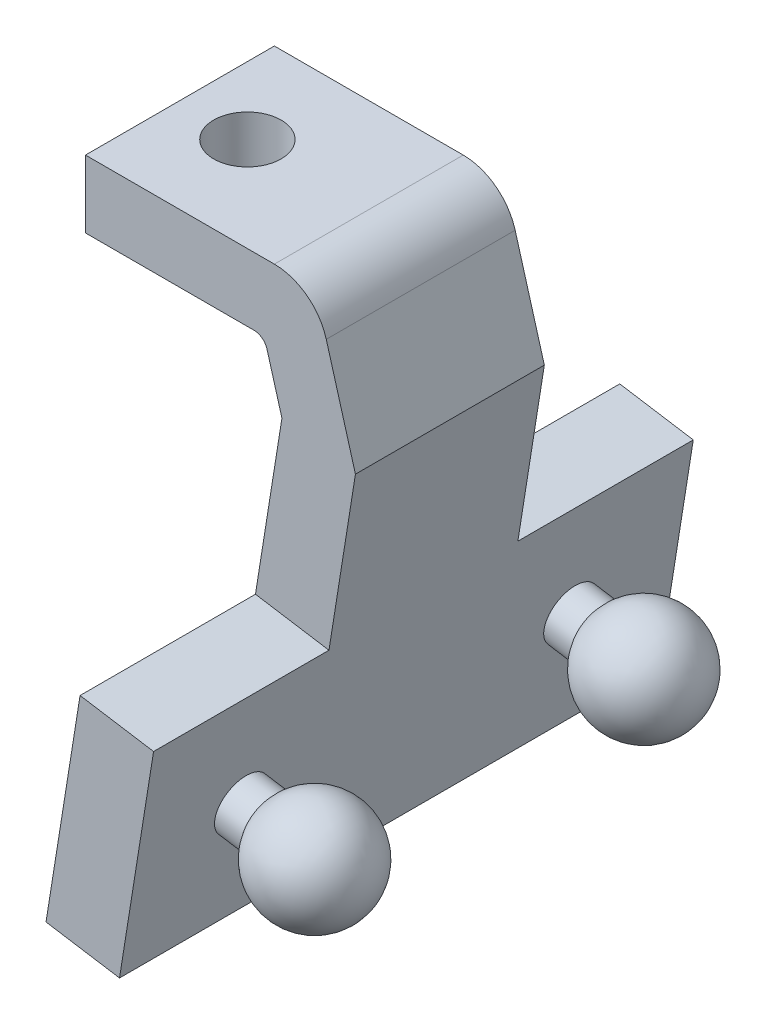
ISO-10303-21;
HEADER;
FILE_DESCRIPTION(('STEP AP214'),'2;1');
FILE_NAME('part.step','',(''),(''),'','','');
FILE_SCHEMA(('AUTOMOTIVE_DESIGN { 1 0 10303 214 1 1 1 1 }'));
ENDSEC;
DATA;
#1=APPLICATION_CONTEXT('core data for automotive mechanical design processes');
#2=APPLICATION_PROTOCOL_DEFINITION('international standard','automotive_design',2000,#1);
#3=PRODUCT_CONTEXT('',#1,'mechanical');
#4=PRODUCT('Part','Part','',(#3));
#5=PRODUCT_RELATED_PRODUCT_CATEGORY('part','',(#4));
#6=PRODUCT_DEFINITION_FORMATION('','',#4);
#7=PRODUCT_DEFINITION_CONTEXT('part definition',#1,'design');
#8=PRODUCT_DEFINITION('design','',#6,#7);
#9=PRODUCT_DEFINITION_SHAPE('','',#8);
#10=(LENGTH_UNIT() NAMED_UNIT(*) SI_UNIT(.MILLI.,.METRE.));
#11=(NAMED_UNIT(*) PLANE_ANGLE_UNIT() SI_UNIT($,.RADIAN.));
#12=(NAMED_UNIT(*) SI_UNIT($,.STERADIAN.) SOLID_ANGLE_UNIT());
#13=UNCERTAINTY_MEASURE_WITH_UNIT(LENGTH_MEASURE(1.E-05),#10,'distance_accuracy_value','');
#14=(GEOMETRIC_REPRESENTATION_CONTEXT(3) GLOBAL_UNCERTAINTY_ASSIGNED_CONTEXT((#13)) GLOBAL_UNIT_ASSIGNED_CONTEXT((#10,
#11,#12)) REPRESENTATION_CONTEXT('',''));
#15=CARTESIAN_POINT('',(0.,0.,0.));
#16=DIRECTION('',(0.,0.,1.));
#17=DIRECTION('',(1.,0.,0.));
#18=AXIS2_PLACEMENT_3D('',#15,#16,#17);
#19=CARTESIAN_POINT('',(0.,0.,3.5));
#20=DIRECTION('',(1.,0.,0.));
#21=DIRECTION('',(0.,0.,-1.));
#22=AXIS2_PLACEMENT_3D('',#19,#20,#21);
#23=PLANE('',#22);
#24=DIRECTION('',(0.,-1.,0.));
#25=VECTOR('',#24,1.);
#26=CARTESIAN_POINT('',(0.,0.,-3.5));
#27=LINE('',#26,#25);
#28=CARTESIAN_POINT('',(0.,2.5,-3.5));
#29=VERTEX_POINT('',#28);
#30=CARTESIAN_POINT('',(0.,0.,-3.5));
#31=VERTEX_POINT('',#30);
#32=EDGE_CURVE('E212',#29,#31,#27,.T.);
#33=ORIENTED_EDGE('',*,*,#32,.T.);
#34=DIRECTION('',(0.,0.,-1.));
#35=VECTOR('',#34,1.);
#36=CARTESIAN_POINT('',(0.,0.,3.5));
#37=LINE('',#36,#35);
#38=CARTESIAN_POINT('',(0.,0.,3.5));
#39=VERTEX_POINT('',#38);
#40=EDGE_CURVE('E252',#39,#31,#37,.T.);
#41=ORIENTED_EDGE('',*,*,#40,.F.);
#42=DIRECTION('',(0.,-1.,0.));
#43=VECTOR('',#42,1.);
#44=CARTESIAN_POINT('',(0.,0.,3.5));
#45=LINE('',#44,#43);
#46=CARTESIAN_POINT('',(0.,2.5,3.5));
#47=VERTEX_POINT('',#46);
#48=EDGE_CURVE('E192',#47,#39,#45,.T.);
#49=ORIENTED_EDGE('',*,*,#48,.F.);
#50=DIRECTION('',(0.,0.,-1.));
#51=VECTOR('',#50,1.);
#52=CARTESIAN_POINT('',(0.,2.5,3.5));
#53=LINE('',#52,#51);
#54=EDGE_CURVE('E211',#47,#29,#53,.T.);
#55=ORIENTED_EDGE('',*,*,#54,.T.);
#56=EDGE_LOOP('',(#33,#41,#49,#55));
#57=FACE_BOUND('',#56,.T.);
#58=ADVANCED_FACE('F41',(#57),#23,.F.);
#59=CARTESIAN_POINT('',(0.,0.,3.5));
#60=DIRECTION('',(0.,1.,0.));
#61=DIRECTION('',(0.,0.,1.));
#62=AXIS2_PLACEMENT_3D('',#59,#60,#61);
#63=PLANE('',#62);
#64=CARTESIAN_POINT('',(2.5,0.,0.));
#65=DIRECTION('',(0.,-1.,0.));
#66=DIRECTION('',(1.,0.,0.));
#67=AXIS2_PLACEMENT_3D('',#64,#65,#66);
#68=CIRCLE('',#67,1.25);
#69=CARTESIAN_POINT('',(3.75,0.,0.));
#70=VERTEX_POINT('',#69);
#71=EDGE_CURVE('E188',#70,#70,#68,.T.);
#72=ORIENTED_EDGE('',*,*,#71,.F.);
#73=EDGE_LOOP('',(#72));
#74=FACE_BOUND('',#73,.T.);
#75=DIRECTION('',(1.,0.,0.));
#76=VECTOR('',#75,1.);
#77=CARTESIAN_POINT('',(0.,0.,-3.5));
#78=LINE('',#77,#76);
#79=CARTESIAN_POINT('',(6.24543275290352,0.,-3.5));
#80=VERTEX_POINT('',#79);
#81=EDGE_CURVE('E215',#31,#80,#78,.T.);
#82=ORIENTED_EDGE('',*,*,#81,.T.);
#83=DIRECTION('',(0.,0.,-1.));
#84=VECTOR('',#83,1.);
#85=CARTESIAN_POINT('',(6.24543275290352,0.,3.5));
#86=LINE('',#85,#84);
#87=CARTESIAN_POINT('',(6.24543275290352,0.,3.5));
#88=VERTEX_POINT('',#87);
#89=EDGE_CURVE('E249',#88,#80,#86,.T.);
#90=ORIENTED_EDGE('',*,*,#89,.F.);
#91=DIRECTION('',(1.,0.,0.));
#92=VECTOR('',#91,1.);
#93=CARTESIAN_POINT('',(0.,0.,3.5));
#94=LINE('',#93,#92);
#95=EDGE_CURVE('E195',#39,#88,#94,.T.);
#96=ORIENTED_EDGE('',*,*,#95,.F.);
#97=ORIENTED_EDGE('',*,*,#40,.T.);
#98=EDGE_LOOP('',(#82,#90,#96,#97));
#99=FACE_BOUND('',#98,.T.);
#100=ADVANCED_FACE('F295',(#74,#99),#63,.F.);
#101=CARTESIAN_POINT('',(6.24543275290367,-0.5,3.5));
#102=DIRECTION('',(0.,0.,-1.));
#103=DIRECTION('',(-1.,0.,0.));
#104=AXIS2_PLACEMENT_3D('',#101,#102,#103);
#105=CYLINDRICAL_SURFACE('',#104,0.499999999999929);
#106=CARTESIAN_POINT('',(6.24543275290367,-0.5,-3.5));
#107=DIRECTION('',(0.,0.,-1.));
#108=DIRECTION('',(-1.,0.,0.));
#109=AXIS2_PLACEMENT_3D('',#106,#107,#108);
#110=CIRCLE('',#109,0.499999999999929);
#111=CARTESIAN_POINT('',(6.72624123981867,-0.362802336352114,-3.5));
#112=VERTEX_POINT('',#111);
#113=EDGE_CURVE('E217',#80,#112,#110,.T.);
#114=ORIENTED_EDGE('',*,*,#113,.T.);
#115=DIRECTION('',(0.,0.,-1.));
#116=VECTOR('',#115,1.);
#117=CARTESIAN_POINT('',(6.72624123981867,-0.362802336352114,3.5));
#118=LINE('',#117,#116);
#119=CARTESIAN_POINT('',(6.72624123981867,-0.362802336352114,3.5));
#120=VERTEX_POINT('',#119);
#121=EDGE_CURVE('E246',#120,#112,#118,.T.);
#122=ORIENTED_EDGE('',*,*,#121,.F.);
#123=CARTESIAN_POINT('',(6.24543275290367,-0.5,3.5));
#124=DIRECTION('',(0.,0.,-1.));
#125=DIRECTION('',(-1.,0.,0.));
#126=AXIS2_PLACEMENT_3D('',#123,#124,#125);
#127=CIRCLE('',#126,0.499999999999929);
#128=EDGE_CURVE('E198',#88,#120,#127,.T.);
#129=ORIENTED_EDGE('',*,*,#128,.F.);
#130=ORIENTED_EDGE('',*,*,#89,.T.);
#131=EDGE_LOOP('',(#114,#122,#129,#130));
#132=FACE_BOUND('',#131,.T.);
#133=ADVANCED_FACE('F291',(#132),#105,.F.);
#134=CARTESIAN_POINT('',(6.7262412398186,-0.362802336352133,3.5));
#135=DIRECTION('',(0.961616973830157,0.274395327295732,0.));
#136=DIRECTION('',(-0.274395327295732,0.961616973830157,0.));
#137=AXIS2_PLACEMENT_3D('',#134,#135,#136);
#138=PLANE('',#137);
#139=DIRECTION('',(0.274395327295732,-0.961616973830156,0.));
#140=VECTOR('',#139,1.);
#141=CARTESIAN_POINT('',(6.7262412398186,-0.362802336352133,-3.5));
#142=LINE('',#141,#140);
#143=CARTESIAN_POINT('',(7.28017081267278,-2.30404559589561,-3.5));
#144=VERTEX_POINT('',#143);
#145=EDGE_CURVE('E219',#112,#144,#142,.T.);
#146=ORIENTED_EDGE('',*,*,#145,.T.);
#147=DIRECTION('',(0.,0.,-1.));
#148=VECTOR('',#147,1.);
#149=CARTESIAN_POINT('',(7.28017081267278,-2.30404559589561,3.5));
#150=LINE('',#149,#148);
#151=CARTESIAN_POINT('',(7.28017081267278,-2.30404559589561,3.5));
#152=VERTEX_POINT('',#151);
#153=EDGE_CURVE('E244',#152,#144,#150,.T.);
#154=ORIENTED_EDGE('',*,*,#153,.F.);
#155=DIRECTION('',(0.274395327295732,-0.961616973830156,0.));
#156=VECTOR('',#155,1.);
#157=CARTESIAN_POINT('',(6.7262412398186,-0.362802336352133,3.5));
#158=LINE('',#157,#156);
#159=EDGE_CURVE('E200',#120,#152,#158,.T.);
#160=ORIENTED_EDGE('',*,*,#159,.F.);
#161=ORIENTED_EDGE('',*,*,#121,.T.);
#162=EDGE_LOOP('',(#146,#154,#160,#161));
#163=FACE_BOUND('',#162,.T.);
#164=ADVANCED_FACE('F286',(#163),#138,.F.);
#165=CARTESIAN_POINT('',(7.28017081267278,-2.30404559589561,3.5));
#166=DIRECTION('',(0.987485427780386,-0.157710272085837,0.));
#167=DIRECTION('',(0.157710272085837,0.987485427780386,0.));
#168=AXIS2_PLACEMENT_3D('',#165,#166,#167);
#169=PLANE('',#168);
#170=DIRECTION('',(-0.157710272085837,-0.987485427780386,0.));
#171=VECTOR('',#170,1.);
#172=CARTESIAN_POINT('',(7.28017081267278,-2.30404559589561,-3.5));
#173=LINE('',#172,#171);
#174=CARTESIAN_POINT('',(6.29949787418476,-8.44442074944566,-3.5));
#175=VERTEX_POINT('',#174);
#176=EDGE_CURVE('E159',#144,#175,#173,.T.);
#177=ORIENTED_EDGE('',*,*,#176,.T.);
#178=DIRECTION('',(0.,0.,1.));
#179=VECTOR('',#178,1.);
#180=CARTESIAN_POINT('',(6.29949787418476,-8.44442074944566,10.));
#181=LINE('',#180,#179);
#182=CARTESIAN_POINT('',(6.29949787418476,-8.44442074944566,-10.));
#183=VERTEX_POINT('',#182);
#184=EDGE_CURVE('E144',#183,#175,#181,.T.);
#185=ORIENTED_EDGE('',*,*,#184,.F.);
#186=DIRECTION('',(0.157710272085847,0.987485427780384,0.));
#187=VECTOR('',#186,1.);
#188=CARTESIAN_POINT('',(6.29949787418476,-8.44442074944566,-10.));
#189=LINE('',#188,#187);
#190=CARTESIAN_POINT('',(5.03781569749799,-16.3443041716887,-10.));
#191=VERTEX_POINT('',#190);
#192=EDGE_CURVE('E156',#191,#183,#189,.T.);
#193=ORIENTED_EDGE('',*,*,#192,.F.);
#194=DIRECTION('',(0.,0.,-1.));
#195=VECTOR('',#194,1.);
#196=CARTESIAN_POINT('',(5.03781569749806,-16.3443041716887,3.5));
#197=LINE('',#196,#195);
#198=CARTESIAN_POINT('',(5.03781569749799,-16.3443041716887,10.));
#199=VERTEX_POINT('',#198);
#200=EDGE_CURVE('E242',#199,#191,#197,.T.);
#201=ORIENTED_EDGE('',*,*,#200,.F.);
#202=DIRECTION('',(-0.157710272085847,-0.987485427780384,0.));
#203=VECTOR('',#202,1.);
#204=CARTESIAN_POINT('',(6.29949787418476,-8.44442074944566,10.));
#205=LINE('',#204,#203);
#206=CARTESIAN_POINT('',(6.29949787418476,-8.44442074944566,10.));
#207=VERTEX_POINT('',#206);
#208=EDGE_CURVE('E150',#207,#199,#205,.T.);
#209=ORIENTED_EDGE('',*,*,#208,.F.);
#210=CARTESIAN_POINT('',(6.29949787418476,-8.44442074944566,3.5));
#211=VERTEX_POINT('',#210);
#212=EDGE_CURVE('E160',#211,#207,#181,.T.);
#213=ORIENTED_EDGE('',*,*,#212,.F.);
#214=DIRECTION('',(-0.157710272085837,-0.987485427780386,0.));
#215=VECTOR('',#214,1.);
#216=CARTESIAN_POINT('',(7.28017081267278,-2.30404559589561,3.5));
#217=LINE('',#216,#215);
#218=EDGE_CURVE('E55',#152,#211,#217,.T.);
#219=ORIENTED_EDGE('',*,*,#218,.F.);
#220=ORIENTED_EDGE('',*,*,#153,.T.);
#221=EDGE_LOOP('',(#177,#185,#193,#201,#209,#213,#219,#220));
#222=FACE_BOUND('',#221,.T.);
#223=ADVANCED_FACE('F155',(#222),#169,.F.);
#224=CARTESIAN_POINT('',(5.03781569749806,-16.3443041716887,3.5));
#225=DIRECTION('',(0.157710272085856,0.987485427780383,0.));
#226=DIRECTION('',(-0.987485427780383,0.157710272085856,0.));
#227=AXIS2_PLACEMENT_3D('',#224,#225,#226);
#228=PLANE('',#227);
#229=ORIENTED_EDGE('',*,*,#200,.T.);
#230=DIRECTION('',(0.987485427780384,-0.157710272085847,0.));
#231=VECTOR('',#230,1.);
#232=CARTESIAN_POINT('',(5.03781569749799,-16.3443041716887,-10.));
#233=LINE('',#232,#231);
#234=CARTESIAN_POINT('',(7.76173973827331,-16.7793392512215,-10.));
#235=VERTEX_POINT('',#234);
#236=EDGE_CURVE('E165',#191,#235,#233,.T.);
#237=ORIENTED_EDGE('',*,*,#236,.T.);
#238=DIRECTION('',(0.,0.,-1.));
#239=VECTOR('',#238,1.);
#240=CARTESIAN_POINT('',(7.76173973827331,-16.7793392512215,3.5));
#241=LINE('',#240,#239);
#242=CARTESIAN_POINT('',(7.76173973827331,-16.7793392512215,10.));
#243=VERTEX_POINT('',#242);
#244=EDGE_CURVE('E240',#243,#235,#241,.T.);
#245=ORIENTED_EDGE('',*,*,#244,.F.);
#246=DIRECTION('',(0.987485427780384,-0.157710272085847,0.));
#247=VECTOR('',#246,1.);
#248=CARTESIAN_POINT('',(5.03781569749799,-16.3443041716887,10.));
#249=LINE('',#248,#247);
#250=EDGE_CURVE('E182',#199,#243,#249,.T.);
#251=ORIENTED_EDGE('',*,*,#250,.F.);
#252=EDGE_LOOP('',(#229,#237,#245,#251));
#253=FACE_BOUND('',#252,.T.);
#254=ADVANCED_FACE('F282',(#253),#228,.F.);
#255=CARTESIAN_POINT('',(7.76173973827331,-16.7793392512215,3.5));
#256=DIRECTION('',(-0.987485427780384,0.157710272085847,0.));
#257=DIRECTION('',(-0.157710272085847,-0.987485427780384,0.));
#258=AXIS2_PLACEMENT_3D('',#255,#256,#257);
#259=PLANE('',#258);
#260=CARTESIAN_POINT('',(8.3925808266167,-12.8293975400999,-6.09939540666506));
#261=DIRECTION('',(-0.987485427780384,0.157710272085847,0.));
#262=DIRECTION('',(0.157710272085847,0.987485427780384,0.));
#263=AXIS2_PLACEMENT_3D('',#260,#261,#262);
#264=CIRCLE('',#263,1.);
#265=CARTESIAN_POINT('',(8.55029109870255,-11.8419121123196,-6.09939540666506));
#266=VERTEX_POINT('',#265);
#267=EDGE_CURVE('E341',#266,#266,#264,.T.);
#268=ORIENTED_EDGE('',*,*,#267,.T.);
#269=EDGE_LOOP('',(#268));
#270=FACE_BOUND('',#269,.T.);
#271=CARTESIAN_POINT('',(8.3925808266167,-12.8293975400999,6.09939540666506));
#272=DIRECTION('',(-0.987485427780384,0.157710272085847,0.));
#273=DIRECTION('',(-0.157710272085847,-0.987485427780384,0.));
#274=AXIS2_PLACEMENT_3D('',#271,#272,#273);
#275=CIRCLE('',#274,1.);
#276=CARTESIAN_POINT('',(8.23487055453085,-13.8168829678803,6.09939540666506));
#277=VERTEX_POINT('',#276);
#278=EDGE_CURVE('E11',#277,#277,#275,.F.);
#279=ORIENTED_EDGE('',*,*,#278,.F.);
#280=EDGE_LOOP('',(#279));
#281=FACE_BOUND('',#280,.T.);
#282=DIRECTION('',(0.157710272085847,0.987485427780384,0.));
#283=VECTOR('',#282,1.);
#284=CARTESIAN_POINT('',(7.76173973827331,-16.7793392512215,3.5));
#285=LINE('',#284,#283);
#286=CARTESIAN_POINT('',(9.02342191496009,-8.8794558289784,3.5));
#287=VERTEX_POINT('',#286);
#288=CARTESIAN_POINT('',(10.0040948534482,-2.73908067542828,3.5));
#289=VERTEX_POINT('',#288);
#290=EDGE_CURVE('E203',#287,#289,#285,.T.);
#291=ORIENTED_EDGE('',*,*,#290,.F.);
#292=DIRECTION('',(0.,0.,1.));
#293=VECTOR('',#292,1.);
#294=CARTESIAN_POINT('',(9.02342191496009,-8.8794558289784,10.));
#295=LINE('',#294,#293);
#296=CARTESIAN_POINT('',(9.02342191496009,-8.8794558289784,10.));
#297=VERTEX_POINT('',#296);
#298=EDGE_CURVE('E178',#287,#297,#295,.T.);
#299=ORIENTED_EDGE('',*,*,#298,.T.);
#300=DIRECTION('',(-0.157710272085847,-0.987485427780384,0.));
#301=VECTOR('',#300,1.);
#302=CARTESIAN_POINT('',(9.02342191496009,-8.8794558289784,10.));
#303=LINE('',#302,#301);
#304=EDGE_CURVE('E166',#297,#243,#303,.T.);
#305=ORIENTED_EDGE('',*,*,#304,.T.);
#306=ORIENTED_EDGE('',*,*,#244,.T.);
#307=DIRECTION('',(0.157710272085847,0.987485427780384,0.));
#308=VECTOR('',#307,1.);
#309=CARTESIAN_POINT('',(9.02342191496009,-8.8794558289784,-10.));
#310=LINE('',#309,#308);
#311=CARTESIAN_POINT('',(9.02342191496009,-8.8794558289784,-10.));
#312=VERTEX_POINT('',#311);
#313=EDGE_CURVE('E176',#235,#312,#310,.T.);
#314=ORIENTED_EDGE('',*,*,#313,.T.);
#315=CARTESIAN_POINT('',(9.02342191496009,-8.8794558289784,-3.5));
#316=VERTEX_POINT('',#315);
#317=EDGE_CURVE('E63',#312,#316,#295,.T.);
#318=ORIENTED_EDGE('',*,*,#317,.T.);
#319=DIRECTION('',(0.157710272085847,0.987485427780384,0.));
#320=VECTOR('',#319,1.);
#321=CARTESIAN_POINT('',(7.76173973827331,-16.7793392512215,-3.5));
#322=LINE('',#321,#320);
#323=CARTESIAN_POINT('',(10.0040948534482,-2.73908067542828,-3.5));
#324=VERTEX_POINT('',#323);
#325=EDGE_CURVE('E222',#316,#324,#322,.T.);
#326=ORIENTED_EDGE('',*,*,#325,.T.);
#327=DIRECTION('',(0.,0.,-1.));
#328=VECTOR('',#327,1.);
#329=CARTESIAN_POINT('',(10.0040948534482,-2.73908067542828,3.5));
#330=LINE('',#329,#328);
#331=EDGE_CURVE('E237',#289,#324,#330,.T.);
#332=ORIENTED_EDGE('',*,*,#331,.F.);
#333=EDGE_LOOP('',(#291,#299,#305,#306,#314,#318,#326,#332));
#334=FACE_BOUND('',#333,.T.);
#335=ADVANCED_FACE('F263',(#270,#281,#334),#259,.F.);
#336=CARTESIAN_POINT('',(10.0040948534482,-2.73908067542828,3.5));
#337=DIRECTION('',(-0.961616973830157,-0.274395327295732,0.));
#338=DIRECTION('',(0.274395327295732,-0.961616973830157,0.));
#339=AXIS2_PLACEMENT_3D('',#336,#337,#338);
#340=PLANE('',#339);
#341=DIRECTION('',(-0.274395327295732,0.961616973830157,0.));
#342=VECTOR('',#341,1.);
#343=CARTESIAN_POINT('',(10.0040948534482,-2.73908067542828,-3.5));
#344=LINE('',#343,#342);
#345=CARTESIAN_POINT('',(8.92323394766049,1.04879065459145,-3.5));
#346=VERTEX_POINT('',#345);
#347=EDGE_CURVE('E224',#324,#346,#344,.T.);
#348=ORIENTED_EDGE('',*,*,#347,.T.);
#349=DIRECTION('',(0.,0.,-1.));
#350=VECTOR('',#349,1.);
#351=CARTESIAN_POINT('',(8.92323394766049,1.04879065459145,3.5));
#352=LINE('',#351,#350);
#353=CARTESIAN_POINT('',(8.92323394766049,1.04879065459145,3.5));
#354=VERTEX_POINT('',#353);
#355=EDGE_CURVE('E234',#354,#346,#352,.T.);
#356=ORIENTED_EDGE('',*,*,#355,.F.);
#357=DIRECTION('',(-0.274395327295732,0.961616973830157,0.));
#358=VECTOR('',#357,1.);
#359=CARTESIAN_POINT('',(10.0040948534482,-2.73908067542828,3.5));
#360=LINE('',#359,#358);
#361=EDGE_CURVE('E205',#289,#354,#360,.T.);
#362=ORIENTED_EDGE('',*,*,#361,.F.);
#363=ORIENTED_EDGE('',*,*,#331,.T.);
#364=EDGE_LOOP('',(#348,#356,#362,#363));
#365=FACE_BOUND('',#364,.T.);
#366=ADVANCED_FACE('F266',(#365),#340,.F.);
#367=CARTESIAN_POINT('',(7.,0.5,3.5));
#368=DIRECTION('',(0.,0.,-1.));
#369=DIRECTION('',(-1.,0.,0.));
#370=AXIS2_PLACEMENT_3D('',#367,#368,#369);
#371=CYLINDRICAL_SURFACE('',#370,2.00000000000008);
#372=CARTESIAN_POINT('',(7.,0.5,-3.5));
#373=DIRECTION('',(0.,0.,1.));
#374=DIRECTION('',(1.,0.,0.));
#375=AXIS2_PLACEMENT_3D('',#372,#373,#374);
#376=CIRCLE('',#375,2.00000000000008);
#377=CARTESIAN_POINT('',(7.,2.50000000000008,-3.5));
#378=VERTEX_POINT('',#377);
#379=EDGE_CURVE('E226',#346,#378,#376,.T.);
#380=ORIENTED_EDGE('',*,*,#379,.T.);
#381=DIRECTION('',(0.,0.,-1.));
#382=VECTOR('',#381,1.);
#383=CARTESIAN_POINT('',(7.,2.50000000000008,3.5));
#384=LINE('',#383,#382);
#385=CARTESIAN_POINT('',(7.,2.50000000000008,3.5));
#386=VERTEX_POINT('',#385);
#387=EDGE_CURVE('E231',#386,#378,#384,.T.);
#388=ORIENTED_EDGE('',*,*,#387,.F.);
#389=CARTESIAN_POINT('',(7.,0.5,3.5));
#390=DIRECTION('',(0.,0.,1.));
#391=DIRECTION('',(1.,0.,0.));
#392=AXIS2_PLACEMENT_3D('',#389,#390,#391);
#393=CIRCLE('',#392,2.00000000000008);
#394=EDGE_CURVE('E207',#354,#386,#393,.T.);
#395=ORIENTED_EDGE('',*,*,#394,.F.);
#396=ORIENTED_EDGE('',*,*,#355,.T.);
#397=EDGE_LOOP('',(#380,#388,#395,#396));
#398=FACE_BOUND('',#397,.T.);
#399=ADVANCED_FACE('F305',(#398),#371,.T.);
#400=CARTESIAN_POINT('',(0.,2.5,3.5));
#401=DIRECTION('',(0.,-1.,0.));
#402=DIRECTION('',(0.,0.,-1.));
#403=AXIS2_PLACEMENT_3D('',#400,#401,#402);
#404=PLANE('',#403);
#405=CARTESIAN_POINT('',(2.5,2.5,0.));
#406=DIRECTION('',(0.,-1.,0.));
#407=DIRECTION('',(0.,0.,-1.));
#408=AXIS2_PLACEMENT_3D('',#405,#406,#407);
#409=CIRCLE('',#408,1.25);
#410=CARTESIAN_POINT('',(2.5,2.5,-1.25));
#411=VERTEX_POINT('',#410);
#412=EDGE_CURVE('E191',#411,#411,#409,.T.);
#413=ORIENTED_EDGE('',*,*,#412,.T.);
#414=EDGE_LOOP('',(#413));
#415=FACE_BOUND('',#414,.T.);
#416=DIRECTION('',(-1.,0.,0.));
#417=VECTOR('',#416,1.);
#418=CARTESIAN_POINT('',(0.,2.5,-3.5));
#419=LINE('',#418,#417);
#420=EDGE_CURVE('E196',#378,#29,#419,.T.);
#421=ORIENTED_EDGE('',*,*,#420,.T.);
#422=ORIENTED_EDGE('',*,*,#54,.F.);
#423=DIRECTION('',(-1.,0.,0.));
#424=VECTOR('',#423,1.);
#425=CARTESIAN_POINT('',(0.,2.5,3.5));
#426=LINE('',#425,#424);
#427=EDGE_CURVE('E209',#386,#47,#426,.T.);
#428=ORIENTED_EDGE('',*,*,#427,.F.);
#429=ORIENTED_EDGE('',*,*,#387,.T.);
#430=EDGE_LOOP('',(#421,#422,#428,#429));
#431=FACE_BOUND('',#430,.T.);
#432=ADVANCED_FACE('F302',(#415,#431),#404,.F.);
#433=CARTESIAN_POINT('',(7.,0.5,3.5));
#434=DIRECTION('',(0.,0.,1.));
#435=DIRECTION('',(1.,0.,0.));
#436=AXIS2_PLACEMENT_3D('',#433,#434,#435);
#437=PLANE('',#436);
#438=DIRECTION('',(-0.987485427780384,0.157710272085847,0.));
#439=VECTOR('',#438,1.);
#440=CARTESIAN_POINT('',(5.58960310371274,-8.33104419293777,3.5));
#441=LINE('',#440,#439);
#442=EDGE_CURVE('E181',#287,#211,#441,.T.);
#443=ORIENTED_EDGE('',*,*,#442,.F.);
#444=ORIENTED_EDGE('',*,*,#290,.T.);
#445=ORIENTED_EDGE('',*,*,#361,.T.);
#446=ORIENTED_EDGE('',*,*,#394,.T.);
#447=ORIENTED_EDGE('',*,*,#427,.T.);
#448=ORIENTED_EDGE('',*,*,#48,.T.);
#449=ORIENTED_EDGE('',*,*,#95,.T.);
#450=ORIENTED_EDGE('',*,*,#128,.T.);
#451=ORIENTED_EDGE('',*,*,#159,.T.);
#452=ORIENTED_EDGE('',*,*,#218,.T.);
#453=EDGE_LOOP('',(#443,#444,#445,#446,#447,#448,#449,#450,#451,#452));
#454=FACE_BOUND('',#453,.T.);
#455=ADVANCED_FACE('F269',(#454),#437,.T.);
#456=CARTESIAN_POINT('',(7.,0.5,-3.5));
#457=DIRECTION('',(0.,0.,1.));
#458=DIRECTION('',(1.,0.,0.));
#459=AXIS2_PLACEMENT_3D('',#456,#457,#458);
#460=PLANE('',#459);
#461=ORIENTED_EDGE('',*,*,#325,.F.);
#462=DIRECTION('',(-0.987485427780384,0.157710272085847,0.));
#463=VECTOR('',#462,1.);
#464=CARTESIAN_POINT('',(5.58960310371274,-8.33104419293777,-3.5));
#465=LINE('',#464,#463);
#466=EDGE_CURVE('E48',#316,#175,#465,.T.);
#467=ORIENTED_EDGE('',*,*,#466,.T.);
#468=ORIENTED_EDGE('',*,*,#176,.F.);
#469=ORIENTED_EDGE('',*,*,#145,.F.);
#470=ORIENTED_EDGE('',*,*,#113,.F.);
#471=ORIENTED_EDGE('',*,*,#81,.F.);
#472=ORIENTED_EDGE('',*,*,#32,.F.);
#473=ORIENTED_EDGE('',*,*,#420,.F.);
#474=ORIENTED_EDGE('',*,*,#379,.F.);
#475=ORIENTED_EDGE('',*,*,#347,.F.);
#476=EDGE_LOOP('',(#461,#467,#468,#469,#470,#471,#472,#473,#474,#475));
#477=FACE_BOUND('',#476,.T.);
#478=ADVANCED_FACE('F258',(#477),#460,.F.);
#479=CARTESIAN_POINT('',(2.5,5.5,0.));
#480=DIRECTION('',(0.,-1.,0.));
#481=DIRECTION('',(1.,0.,0.));
#482=AXIS2_PLACEMENT_3D('',#479,#480,#481);
#483=CYLINDRICAL_SURFACE('',#482,1.25);
#484=ORIENTED_EDGE('',*,*,#71,.T.);
#485=EDGE_LOOP('',(#484));
#486=FACE_BOUND('',#485,.T.);
#487=ORIENTED_EDGE('',*,*,#412,.F.);
#488=EDGE_LOOP('',(#487));
#489=FACE_BOUND('',#488,.T.);
#490=ADVANCED_FACE('F363',(#486,#489),#483,.F.);
#491=CARTESIAN_POINT('',(6.29949787418476,-8.44442074944566,-10.));
#492=DIRECTION('',(0.,0.,-1.));
#493=DIRECTION('',(0.,1.,0.));
#494=AXIS2_PLACEMENT_3D('',#491,#492,#493);
#495=PLANE('',#494);
#496=ORIENTED_EDGE('',*,*,#313,.F.);
#497=ORIENTED_EDGE('',*,*,#236,.F.);
#498=ORIENTED_EDGE('',*,*,#192,.T.);
#499=DIRECTION('',(0.987485427780384,-0.157710272085847,0.));
#500=VECTOR('',#499,1.);
#501=CARTESIAN_POINT('',(6.29949787418476,-8.44442074944566,-10.));
#502=LINE('',#501,#500);
#503=EDGE_CURVE('E141',#183,#312,#502,.T.);
#504=ORIENTED_EDGE('',*,*,#503,.T.);
#505=EDGE_LOOP('',(#496,#497,#498,#504));
#506=FACE_BOUND('',#505,.T.);
#507=ADVANCED_FACE('F163',(#506),#495,.T.);
#508=CARTESIAN_POINT('',(6.29949787418476,-8.44442074944566,10.));
#509=DIRECTION('',(0.157710272085847,0.987485427780384,0.));
#510=DIRECTION('',(-0.987485427780384,0.157710272085847,0.));
#511=AXIS2_PLACEMENT_3D('',#508,#509,#510);
#512=PLANE('',#511);
#513=ORIENTED_EDGE('',*,*,#466,.F.);
#514=ORIENTED_EDGE('',*,*,#317,.F.);
#515=ORIENTED_EDGE('',*,*,#503,.F.);
#516=ORIENTED_EDGE('',*,*,#184,.T.);
#517=EDGE_LOOP('',(#513,#514,#515,#516));
#518=FACE_BOUND('',#517,.T.);
#519=ADVANCED_FACE('F143',(#518),#512,.T.);
#520=CARTESIAN_POINT('',(6.29949787418476,-8.44442074944566,10.));
#521=DIRECTION('',(0.,0.,1.));
#522=DIRECTION('',(1.,0.,0.));
#523=AXIS2_PLACEMENT_3D('',#520,#521,#522);
#524=PLANE('',#523);
#525=ORIENTED_EDGE('',*,*,#304,.F.);
#526=DIRECTION('',(0.987485427780384,-0.157710272085847,0.));
#527=VECTOR('',#526,1.);
#528=CARTESIAN_POINT('',(6.29949787418476,-8.44442074944566,10.));
#529=LINE('',#528,#527);
#530=EDGE_CURVE('E149',#207,#297,#529,.T.);
#531=ORIENTED_EDGE('',*,*,#530,.F.);
#532=ORIENTED_EDGE('',*,*,#208,.T.);
#533=ORIENTED_EDGE('',*,*,#250,.T.);
#534=EDGE_LOOP('',(#525,#531,#532,#533));
#535=FACE_BOUND('',#534,.T.);
#536=ADVANCED_FACE('F279',(#535),#524,.T.);
#537=ORIENTED_EDGE('',*,*,#298,.F.);
#538=ORIENTED_EDGE('',*,*,#442,.T.);
#539=ORIENTED_EDGE('',*,*,#212,.T.);
#540=ORIENTED_EDGE('',*,*,#530,.T.);
#541=EDGE_LOOP('',(#537,#538,#539,#540));
#542=FACE_BOUND('',#541,.T.);
#543=ADVANCED_FACE('F275',(#542),#512,.T.);
#544=CARTESIAN_POINT('',(9.38006625439709,-12.9871078121858,6.09939540666506));
#545=DIRECTION('',(-0.987485427780384,0.157710272085847,0.));
#546=DIRECTION('',(-0.157710272085847,-0.987485427780384,0.));
#547=AXIS2_PLACEMENT_3D('',#544,#545,#546);
#548=CYLINDRICAL_SURFACE('',#547,1.);
#549=CARTESIAN_POINT('',(9.38006625439709,-12.9871078121858,6.09939540666506));
#550=DIRECTION('',(0.987485427780384,-0.157710272085847,0.));
#551=DIRECTION('',(0.157710272085847,0.987485427780384,0.));
#552=AXIS2_PLACEMENT_3D('',#549,#550,#551);
#553=CIRCLE('',#552,1.);
#554=CARTESIAN_POINT('',(9.53777652648293,-11.9996223844054,6.09939540666506));
#555=VERTEX_POINT('',#554);
#556=EDGE_CURVE('E171',#555,#555,#553,.T.);
#557=ORIENTED_EDGE('',*,*,#556,.F.);
#558=EDGE_LOOP('',(#557));
#559=FACE_BOUND('',#558,.T.);
#560=ORIENTED_EDGE('',*,*,#278,.T.);
#561=EDGE_LOOP('',(#560));
#562=FACE_BOUND('',#561,.T.);
#563=ADVANCED_FACE('F344',(#559,#562),#548,.T.);
#564=CARTESIAN_POINT('',(11.0904411870466,-13.260270016314,6.09939540666506));
#565=DIRECTION('',(-0.987485427780384,0.157710272085848,0.));
#566=DIRECTION('',(0.,0.,1.));
#567=AXIS2_PLACEMENT_3D('',#564,#565,#566);
#568=SPHERICAL_SURFACE('',#567,2.);
#569=ORIENTED_EDGE('',*,*,#556,.T.);
#570=EDGE_LOOP('',(#569));
#571=FACE_BOUND('',#570,.T.);
#572=ADVANCED_FACE('F346',(#571),#568,.T.);
#573=CARTESIAN_POINT('',(9.38006625439709,-12.9871078121858,-6.09939540666506));
#574=DIRECTION('',(-0.987485427780384,0.157710272085847,0.));
#575=DIRECTION('',(-0.157710272085847,-0.987485427780384,0.));
#576=AXIS2_PLACEMENT_3D('',#573,#574,#575);
#577=CYLINDRICAL_SURFACE('',#576,1.);
#578=CARTESIAN_POINT('',(9.38006625439709,-12.9871078121858,-6.09939540666506));
#579=DIRECTION('',(0.987485427780384,-0.157710272085848,0.));
#580=DIRECTION('',(-0.157710272085848,-0.987485427780384,0.));
#581=AXIS2_PLACEMENT_3D('',#578,#579,#580);
#582=CIRCLE('',#581,1.);
#583=CARTESIAN_POINT('',(9.22235598231124,-13.9745932399662,-6.09939540666506));
#584=VERTEX_POINT('',#583);
#585=EDGE_CURVE('E429',#584,#584,#582,.T.);
#586=ORIENTED_EDGE('',*,*,#585,.F.);
#587=EDGE_LOOP('',(#586));
#588=FACE_BOUND('',#587,.T.);
#589=ORIENTED_EDGE('',*,*,#267,.F.);
#590=EDGE_LOOP('',(#589));
#591=FACE_BOUND('',#590,.T.);
#592=ADVANCED_FACE('F352',(#588,#591),#577,.T.);
#593=CARTESIAN_POINT('',(11.0904411870466,-13.260270016314,-6.09939540666506));
#594=DIRECTION('',(-0.987485427780384,0.157710272085848,0.));
#595=DIRECTION('',(0.,0.,-1.));
#596=AXIS2_PLACEMENT_3D('',#593,#594,#595);
#597=SPHERICAL_SURFACE('',#596,2.);
#598=ORIENTED_EDGE('',*,*,#585,.T.);
#599=EDGE_LOOP('',(#598));
#600=FACE_BOUND('',#599,.T.);
#601=ADVANCED_FACE('F415',(#600),#597,.T.);
#602=CLOSED_SHELL('',(#58,#100,#133,#164,#223,#254,#335,#366,#399,#432,#455,#478,#490,#507,#519,
#536,#543,#563,#572,#592,#601));
#603=MANIFOLD_SOLID_BREP('B2',#602);
#604=ADVANCED_BREP_SHAPE_REPRESENTATION('',(#18,#603),#14);
#605=SHAPE_DEFINITION_REPRESENTATION(#9,#604);
ENDSEC;
END-ISO-10303-21;
